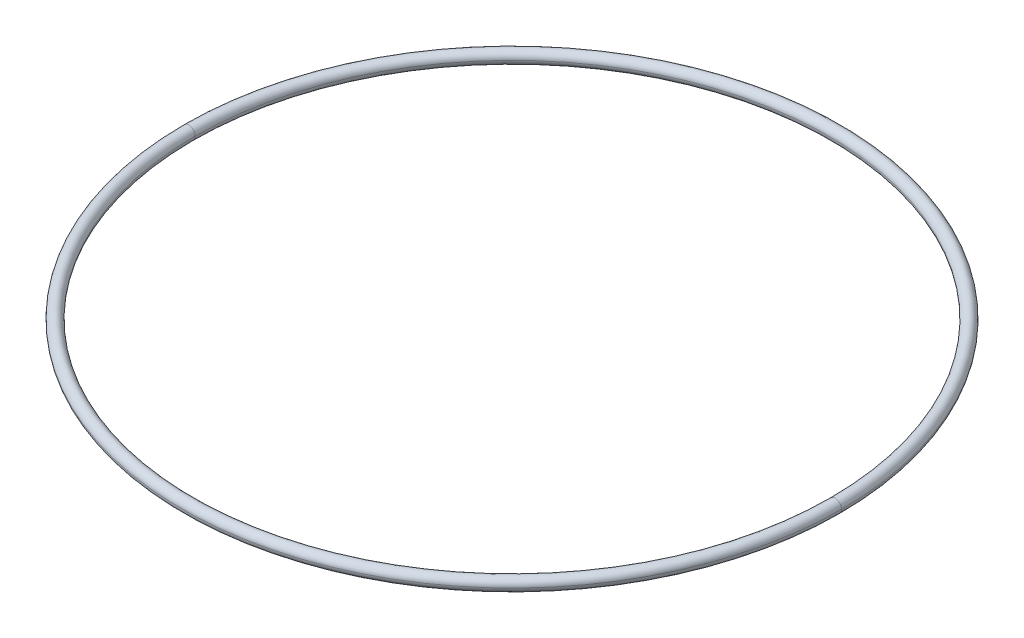
ISO-10303-21;
HEADER;
FILE_DESCRIPTION(('STEP AP214'),'2;1');
FILE_NAME('part.step','',(''),(''),'','','');
FILE_SCHEMA(('AUTOMOTIVE_DESIGN { 1 0 10303 214 1 1 1 1 }'));
ENDSEC;
DATA;
#1=APPLICATION_CONTEXT('core data for automotive mechanical design processes');
#2=APPLICATION_PROTOCOL_DEFINITION('international standard','automotive_design',2000,#1);
#3=PRODUCT_CONTEXT('',#1,'mechanical');
#4=PRODUCT('Part','Part','',(#3));
#5=PRODUCT_RELATED_PRODUCT_CATEGORY('part','',(#4));
#6=PRODUCT_DEFINITION_FORMATION('','',#4);
#7=PRODUCT_DEFINITION_CONTEXT('part definition',#1,'design');
#8=PRODUCT_DEFINITION('design','',#6,#7);
#9=PRODUCT_DEFINITION_SHAPE('','',#8);
#10=(LENGTH_UNIT() NAMED_UNIT(*) SI_UNIT(.MILLI.,.METRE.));
#11=(NAMED_UNIT(*) PLANE_ANGLE_UNIT() SI_UNIT($,.RADIAN.));
#12=(NAMED_UNIT(*) SI_UNIT($,.STERADIAN.) SOLID_ANGLE_UNIT());
#13=UNCERTAINTY_MEASURE_WITH_UNIT(LENGTH_MEASURE(1.E-05),#10,'distance_accuracy_value','');
#14=(GEOMETRIC_REPRESENTATION_CONTEXT(3) GLOBAL_UNCERTAINTY_ASSIGNED_CONTEXT((#13)) GLOBAL_UNIT_ASSIGNED_CONTEXT((#10,
#11,#12)) REPRESENTATION_CONTEXT('',''));
#15=CARTESIAN_POINT('',(0.,0.,0.));
#16=DIRECTION('',(0.,0.,1.));
#17=DIRECTION('',(1.,0.,0.));
#18=AXIS2_PLACEMENT_3D('',#15,#16,#17);
#19=CARTESIAN_POINT('',(0.,0.,0.));
#20=DIRECTION('',(0.,-1.,0.));
#21=DIRECTION('',(-1.,0.,0.));
#22=AXIS2_PLACEMENT_3D('',#19,#20,#21);
#23=TOROIDAL_SURFACE('',#22,50.5,1.);
#24=CARTESIAN_POINT('',(0.,0.,0.));
#25=DIRECTION('',(0.,-1.,0.));
#26=DIRECTION('',(-1.,0.,0.));
#27=AXIS2_PLACEMENT_3D('',#24,#25,#26);
#28=CIRCLE('',#27,51.5);
#29=CARTESIAN_POINT('',(-51.5,0.,0.));
#30=VERTEX_POINT('',#29);
#31=CARTESIAN_POINT('',(51.5,0.,0.));
#32=VERTEX_POINT('',#31);
#33=EDGE_CURVE('E67',#30,#32,#28,.T.);
#34=ORIENTED_EDGE('',*,*,#33,.T.);
#35=CARTESIAN_POINT('',(50.5,0.,0.));
#36=DIRECTION('',(0.,0.,-1.));
#37=DIRECTION('',(1.,0.,0.));
#38=AXIS2_PLACEMENT_3D('',#35,#36,#37);
#39=CIRCLE('',#38,1.);
#40=CARTESIAN_POINT('',(49.5,0.,0.));
#41=VERTEX_POINT('',#40);
#42=EDGE_CURVE('E25',#32,#41,#39,.T.);
#43=ORIENTED_EDGE('',*,*,#42,.T.);
#44=CARTESIAN_POINT('',(0.,0.,0.));
#45=DIRECTION('',(0.,-1.,0.));
#46=DIRECTION('',(-1.,0.,0.));
#47=AXIS2_PLACEMENT_3D('',#44,#45,#46);
#48=CIRCLE('',#47,49.5);
#49=CARTESIAN_POINT('',(-49.5,0.,0.));
#50=VERTEX_POINT('',#49);
#51=EDGE_CURVE('E66',#50,#41,#48,.T.);
#52=ORIENTED_EDGE('',*,*,#51,.F.);
#53=CARTESIAN_POINT('',(-50.5,0.,0.));
#54=DIRECTION('',(0.,0.,1.));
#55=DIRECTION('',(-1.,0.,0.));
#56=AXIS2_PLACEMENT_3D('',#53,#54,#55);
#57=CIRCLE('',#56,1.);
#58=EDGE_CURVE('E10',#30,#50,#57,.T.);
#59=ORIENTED_EDGE('',*,*,#58,.F.);
#60=EDGE_LOOP('',(#34,#43,#52,#59));
#61=FACE_BOUND('',#60,.T.);
#62=ADVANCED_FACE('F15',(#61),#23,.T.);
#63=CARTESIAN_POINT('',(0.,0.,0.));
#64=DIRECTION('',(0.,-1.,0.));
#65=DIRECTION('',(-1.,0.,0.));
#66=AXIS2_PLACEMENT_3D('',#63,#64,#65);
#67=TOROIDAL_SURFACE('',#66,50.5,1.);
#68=CARTESIAN_POINT('',(0.,0.,0.));
#69=DIRECTION('',(0.,1.,0.));
#70=DIRECTION('',(-1.,0.,0.));
#71=AXIS2_PLACEMENT_3D('',#68,#69,#70);
#72=CIRCLE('',#71,49.5);
#73=EDGE_CURVE('E50',#50,#41,#72,.T.);
#74=ORIENTED_EDGE('',*,*,#73,.T.);
#75=ORIENTED_EDGE('',*,*,#42,.F.);
#76=CARTESIAN_POINT('',(0.,0.,0.));
#77=DIRECTION('',(0.,1.,0.));
#78=DIRECTION('',(-1.,0.,0.));
#79=AXIS2_PLACEMENT_3D('',#76,#77,#78);
#80=CIRCLE('',#79,51.5);
#81=EDGE_CURVE('E53',#30,#32,#80,.T.);
#82=ORIENTED_EDGE('',*,*,#81,.F.);
#83=ORIENTED_EDGE('',*,*,#58,.T.);
#84=EDGE_LOOP('',(#74,#75,#82,#83));
#85=FACE_BOUND('',#84,.T.);
#86=ADVANCED_FACE('F49',(#85),#67,.T.);
#87=CARTESIAN_POINT('',(0.,0.,0.));
#88=DIRECTION('',(0.,-1.,0.));
#89=DIRECTION('',(-1.,0.,0.));
#90=AXIS2_PLACEMENT_3D('',#87,#88,#89);
#91=TOROIDAL_SURFACE('',#90,50.5,1.);
#92=ORIENTED_EDGE('',*,*,#81,.T.);
#93=CARTESIAN_POINT('',(50.5,0.,0.));
#94=DIRECTION('',(0.,0.,-1.));
#95=DIRECTION('',(-1.,0.,0.));
#96=AXIS2_PLACEMENT_3D('',#93,#94,#95);
#97=CIRCLE('',#96,1.);
#98=EDGE_CURVE('E61',#41,#32,#97,.T.);
#99=ORIENTED_EDGE('',*,*,#98,.F.);
#100=ORIENTED_EDGE('',*,*,#73,.F.);
#101=CARTESIAN_POINT('',(-50.5,0.,0.));
#102=DIRECTION('',(0.,0.,1.));
#103=DIRECTION('',(1.,0.,0.));
#104=AXIS2_PLACEMENT_3D('',#101,#102,#103);
#105=CIRCLE('',#104,1.);
#106=EDGE_CURVE('E58',#50,#30,#105,.T.);
#107=ORIENTED_EDGE('',*,*,#106,.T.);
#108=EDGE_LOOP('',(#92,#99,#100,#107));
#109=FACE_BOUND('',#108,.T.);
#110=ADVANCED_FACE('F57',(#109),#91,.T.);
#111=CARTESIAN_POINT('',(0.,0.,0.));
#112=DIRECTION('',(0.,-1.,0.));
#113=DIRECTION('',(-1.,0.,0.));
#114=AXIS2_PLACEMENT_3D('',#111,#112,#113);
#115=TOROIDAL_SURFACE('',#114,50.5,1.);
#116=ORIENTED_EDGE('',*,*,#51,.T.);
#117=ORIENTED_EDGE('',*,*,#98,.T.);
#118=ORIENTED_EDGE('',*,*,#33,.F.);
#119=ORIENTED_EDGE('',*,*,#106,.F.);
#120=EDGE_LOOP('',(#116,#117,#118,#119));
#121=FACE_BOUND('',#120,.T.);
#122=ADVANCED_FACE('F17',(#121),#115,.T.);
#123=CLOSED_SHELL('',(#62,#86,#110,#122));
#124=MANIFOLD_SOLID_BREP('B1',#123);
#125=ADVANCED_BREP_SHAPE_REPRESENTATION('',(#18,#124),#14);
#126=SHAPE_DEFINITION_REPRESENTATION(#9,#125);
ENDSEC;
END-ISO-10303-21;
